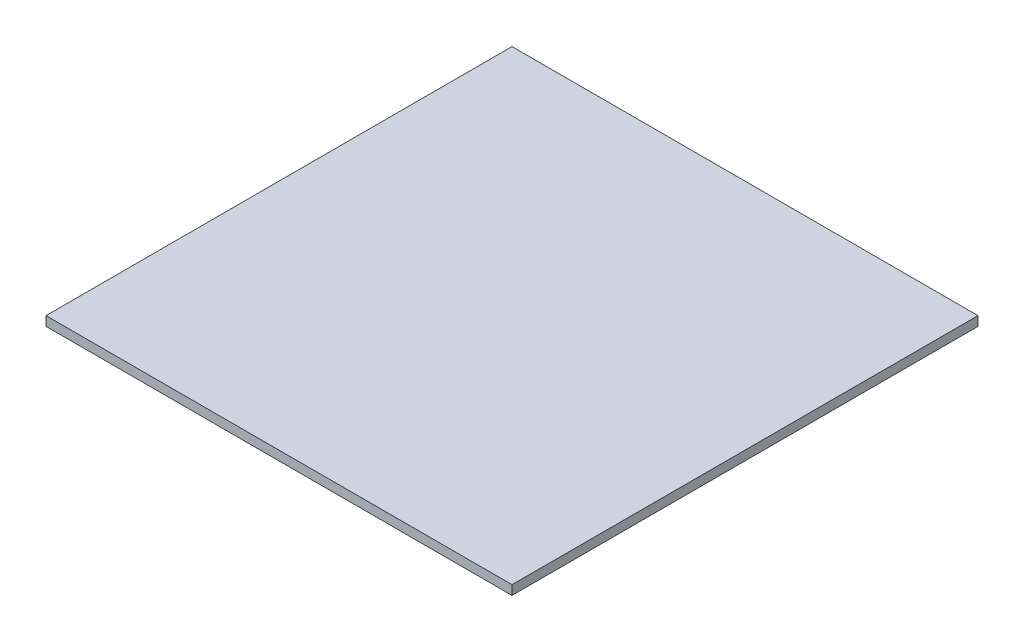
ISO-10303-21;
HEADER;
FILE_DESCRIPTION(('STEP AP214'),'2;1');
FILE_NAME('part.step','',(''),(''),'','','');
FILE_SCHEMA(('AUTOMOTIVE_DESIGN { 1 0 10303 214 1 1 1 1 }'));
ENDSEC;
DATA;
#1=APPLICATION_CONTEXT('core data for automotive mechanical design processes');
#2=APPLICATION_PROTOCOL_DEFINITION('international standard','automotive_design',2000,#1);
#3=PRODUCT_CONTEXT('',#1,'mechanical');
#4=PRODUCT('Part','Part','',(#3));
#5=PRODUCT_RELATED_PRODUCT_CATEGORY('part','',(#4));
#6=PRODUCT_DEFINITION_FORMATION('','',#4);
#7=PRODUCT_DEFINITION_CONTEXT('part definition',#1,'design');
#8=PRODUCT_DEFINITION('design','',#6,#7);
#9=PRODUCT_DEFINITION_SHAPE('','',#8);
#10=(LENGTH_UNIT() NAMED_UNIT(*) SI_UNIT(.MILLI.,.METRE.));
#11=(NAMED_UNIT(*) PLANE_ANGLE_UNIT() SI_UNIT($,.RADIAN.));
#12=(NAMED_UNIT(*) SI_UNIT($,.STERADIAN.) SOLID_ANGLE_UNIT());
#13=UNCERTAINTY_MEASURE_WITH_UNIT(LENGTH_MEASURE(1.E-05),#10,'distance_accuracy_value','');
#14=(GEOMETRIC_REPRESENTATION_CONTEXT(3) GLOBAL_UNCERTAINTY_ASSIGNED_CONTEXT((#13)) GLOBAL_UNIT_ASSIGNED_CONTEXT((#10,
#11,#12)) REPRESENTATION_CONTEXT('',''));
#15=CARTESIAN_POINT('',(0.,0.,0.));
#16=DIRECTION('',(0.,0.,1.));
#17=DIRECTION('',(1.,0.,0.));
#18=AXIS2_PLACEMENT_3D('',#15,#16,#17);
#19=CARTESIAN_POINT('',(250.,10.,250.));
#20=DIRECTION('',(-1.,0.,0.));
#21=DIRECTION('',(0.,0.,1.));
#22=AXIS2_PLACEMENT_3D('',#19,#20,#21);
#23=PLANE('',#22);
#24=DIRECTION('',(0.,0.,-1.));
#25=VECTOR('',#24,1.);
#26=CARTESIAN_POINT('',(250.,0.,250.));
#27=LINE('',#26,#25);
#28=CARTESIAN_POINT('',(250.,0.,250.));
#29=VERTEX_POINT('',#28);
#30=CARTESIAN_POINT('',(250.,0.,-250.));
#31=VERTEX_POINT('',#30);
#32=EDGE_CURVE('E96',#29,#31,#27,.T.);
#33=ORIENTED_EDGE('',*,*,#32,.T.);
#34=DIRECTION('',(0.,-1.,0.));
#35=VECTOR('',#34,1.);
#36=CARTESIAN_POINT('',(250.,10.,-250.));
#37=LINE('',#36,#35);
#38=CARTESIAN_POINT('',(250.,10.,-250.));
#39=VERTEX_POINT('',#38);
#40=EDGE_CURVE('E11',#39,#31,#37,.T.);
#41=ORIENTED_EDGE('',*,*,#40,.F.);
#42=DIRECTION('',(0.,0.,-1.));
#43=VECTOR('',#42,1.);
#44=CARTESIAN_POINT('',(250.,10.,250.));
#45=LINE('',#44,#43);
#46=CARTESIAN_POINT('',(250.,10.,250.));
#47=VERTEX_POINT('',#46);
#48=EDGE_CURVE('E84',#47,#39,#45,.T.);
#49=ORIENTED_EDGE('',*,*,#48,.F.);
#50=DIRECTION('',(0.,-1.,0.));
#51=VECTOR('',#50,1.);
#52=CARTESIAN_POINT('',(250.,10.,250.));
#53=LINE('',#52,#51);
#54=EDGE_CURVE('E92',#47,#29,#53,.T.);
#55=ORIENTED_EDGE('',*,*,#54,.T.);
#56=EDGE_LOOP('',(#33,#41,#49,#55));
#57=FACE_BOUND('',#56,.T.);
#58=ADVANCED_FACE('F33',(#57),#23,.F.);
#59=CARTESIAN_POINT('',(-250.,10.,-250.));
#60=DIRECTION('',(0.,0.,1.));
#61=DIRECTION('',(1.,0.,0.));
#62=AXIS2_PLACEMENT_3D('',#59,#60,#61);
#63=PLANE('',#62);
#64=DIRECTION('',(-1.,0.,0.));
#65=VECTOR('',#64,1.);
#66=CARTESIAN_POINT('',(-250.,0.,-250.));
#67=LINE('',#66,#65);
#68=CARTESIAN_POINT('',(-250.,0.,-250.));
#69=VERTEX_POINT('',#68);
#70=EDGE_CURVE('E88',#31,#69,#67,.T.);
#71=ORIENTED_EDGE('',*,*,#70,.T.);
#72=DIRECTION('',(0.,-1.,0.));
#73=VECTOR('',#72,1.);
#74=CARTESIAN_POINT('',(-250.,10.,-250.));
#75=LINE('',#74,#73);
#76=CARTESIAN_POINT('',(-250.,10.,-250.));
#77=VERTEX_POINT('',#76);
#78=EDGE_CURVE('E41',#77,#69,#75,.T.);
#79=ORIENTED_EDGE('',*,*,#78,.F.);
#80=DIRECTION('',(-1.,0.,0.));
#81=VECTOR('',#80,1.);
#82=CARTESIAN_POINT('',(-250.,10.,-250.));
#83=LINE('',#82,#81);
#84=EDGE_CURVE('E79',#39,#77,#83,.T.);
#85=ORIENTED_EDGE('',*,*,#84,.F.);
#86=ORIENTED_EDGE('',*,*,#40,.T.);
#87=EDGE_LOOP('',(#71,#79,#85,#86));
#88=FACE_BOUND('',#87,.T.);
#89=ADVANCED_FACE('F87',(#88),#63,.F.);
#90=CARTESIAN_POINT('',(-250.,10.,250.));
#91=DIRECTION('',(1.,0.,0.));
#92=DIRECTION('',(0.,0.,-1.));
#93=AXIS2_PLACEMENT_3D('',#90,#91,#92);
#94=PLANE('',#93);
#95=DIRECTION('',(0.,0.,1.));
#96=VECTOR('',#95,1.);
#97=CARTESIAN_POINT('',(-250.,0.,250.));
#98=LINE('',#97,#96);
#99=CARTESIAN_POINT('',(-250.,0.,250.));
#100=VERTEX_POINT('',#99);
#101=EDGE_CURVE('E66',#69,#100,#98,.T.);
#102=ORIENTED_EDGE('',*,*,#101,.T.);
#103=DIRECTION('',(0.,-1.,0.));
#104=VECTOR('',#103,1.);
#105=CARTESIAN_POINT('',(-250.,10.,250.));
#106=LINE('',#105,#104);
#107=CARTESIAN_POINT('',(-250.,10.,250.));
#108=VERTEX_POINT('',#107);
#109=EDGE_CURVE('E89',#108,#100,#106,.T.);
#110=ORIENTED_EDGE('',*,*,#109,.F.);
#111=DIRECTION('',(0.,0.,1.));
#112=VECTOR('',#111,1.);
#113=CARTESIAN_POINT('',(-250.,10.,250.));
#114=LINE('',#113,#112);
#115=EDGE_CURVE('E82',#77,#108,#114,.T.);
#116=ORIENTED_EDGE('',*,*,#115,.F.);
#117=ORIENTED_EDGE('',*,*,#78,.T.);
#118=EDGE_LOOP('',(#102,#110,#116,#117));
#119=FACE_BOUND('',#118,.T.);
#120=ADVANCED_FACE('F90',(#119),#94,.F.);
#121=CARTESIAN_POINT('',(-250.,10.,250.));
#122=DIRECTION('',(0.,0.,-1.));
#123=DIRECTION('',(-1.,0.,0.));
#124=AXIS2_PLACEMENT_3D('',#121,#122,#123);
#125=PLANE('',#124);
#126=DIRECTION('',(1.,0.,0.));
#127=VECTOR('',#126,1.);
#128=CARTESIAN_POINT('',(-250.,0.,250.));
#129=LINE('',#128,#127);
#130=EDGE_CURVE('E72',#100,#29,#129,.T.);
#131=ORIENTED_EDGE('',*,*,#130,.T.);
#132=ORIENTED_EDGE('',*,*,#54,.F.);
#133=DIRECTION('',(1.,0.,0.));
#134=VECTOR('',#133,1.);
#135=CARTESIAN_POINT('',(-250.,10.,250.));
#136=LINE('',#135,#134);
#137=EDGE_CURVE('E49',#108,#47,#136,.T.);
#138=ORIENTED_EDGE('',*,*,#137,.F.);
#139=ORIENTED_EDGE('',*,*,#109,.T.);
#140=EDGE_LOOP('',(#131,#132,#138,#139));
#141=FACE_BOUND('',#140,.T.);
#142=ADVANCED_FACE('F103',(#141),#125,.F.);
#143=CARTESIAN_POINT('',(0.,10.,0.));
#144=DIRECTION('',(0.,-1.,0.));
#145=DIRECTION('',(0.,0.,-1.));
#146=AXIS2_PLACEMENT_3D('',#143,#144,#145);
#147=PLANE('',#146);
#148=ORIENTED_EDGE('',*,*,#48,.T.);
#149=ORIENTED_EDGE('',*,*,#84,.T.);
#150=ORIENTED_EDGE('',*,*,#115,.T.);
#151=ORIENTED_EDGE('',*,*,#137,.T.);
#152=EDGE_LOOP('',(#148,#149,#150,#151));
#153=FACE_BOUND('',#152,.T.);
#154=ADVANCED_FACE('F80',(#153),#147,.F.);
#155=CARTESIAN_POINT('',(0.,0.,0.));
#156=DIRECTION('',(0.,-1.,0.));
#157=DIRECTION('',(0.,0.,-1.));
#158=AXIS2_PLACEMENT_3D('',#155,#156,#157);
#159=PLANE('',#158);
#160=ORIENTED_EDGE('',*,*,#32,.F.);
#161=ORIENTED_EDGE('',*,*,#130,.F.);
#162=ORIENTED_EDGE('',*,*,#101,.F.);
#163=ORIENTED_EDGE('',*,*,#70,.F.);
#164=EDGE_LOOP('',(#160,#161,#162,#163));
#165=FACE_BOUND('',#164,.T.);
#166=ADVANCED_FACE('F106',(#165),#159,.T.);
#167=CLOSED_SHELL('',(#58,#89,#120,#142,#154,#166));
#168=MANIFOLD_SOLID_BREP('B2',#167);
#169=ADVANCED_BREP_SHAPE_REPRESENTATION('',(#18,#168),#14);
#170=SHAPE_DEFINITION_REPRESENTATION(#9,#169);
ENDSEC;
END-ISO-10303-21;
